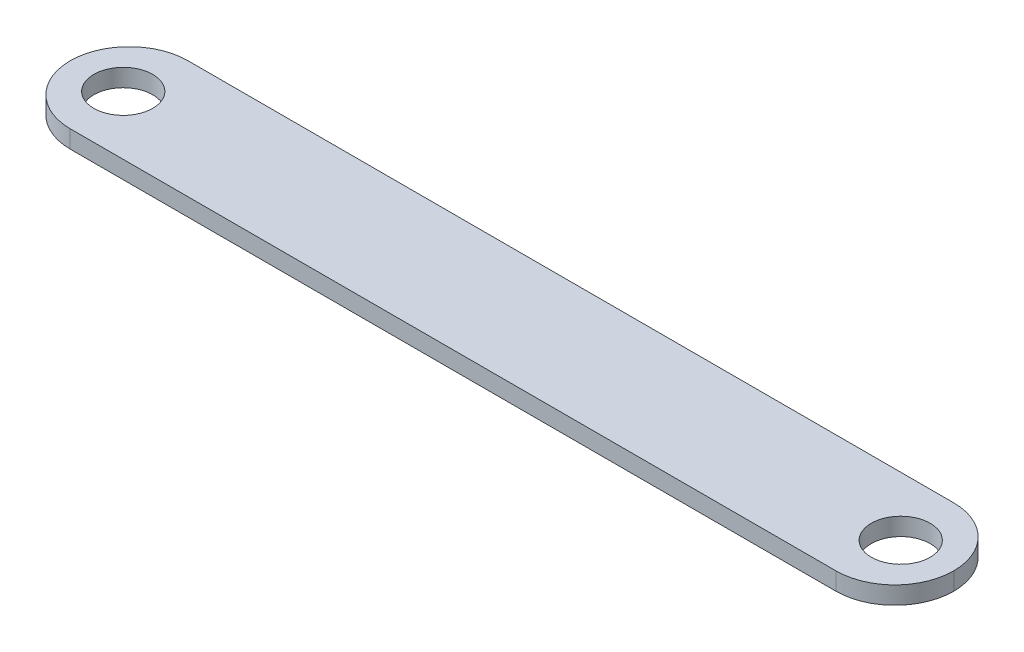
ISO-10303-21;
HEADER;
FILE_DESCRIPTION(('STEP AP214'),'2;1');
FILE_NAME('part.step','',(''),(''),'','','');
FILE_SCHEMA(('AUTOMOTIVE_DESIGN { 1 0 10303 214 1 1 1 1 }'));
ENDSEC;
DATA;
#1=APPLICATION_CONTEXT('core data for automotive mechanical design processes');
#2=APPLICATION_PROTOCOL_DEFINITION('international standard','automotive_design',2000,#1);
#3=PRODUCT_CONTEXT('',#1,'mechanical');
#4=PRODUCT('Part','Part','',(#3));
#5=PRODUCT_RELATED_PRODUCT_CATEGORY('part','',(#4));
#6=PRODUCT_DEFINITION_FORMATION('','',#4);
#7=PRODUCT_DEFINITION_CONTEXT('part definition',#1,'design');
#8=PRODUCT_DEFINITION('design','',#6,#7);
#9=PRODUCT_DEFINITION_SHAPE('','',#8);
#10=(LENGTH_UNIT() NAMED_UNIT(*) SI_UNIT(.MILLI.,.METRE.));
#11=(NAMED_UNIT(*) PLANE_ANGLE_UNIT() SI_UNIT($,.RADIAN.));
#12=(NAMED_UNIT(*) SI_UNIT($,.STERADIAN.) SOLID_ANGLE_UNIT());
#13=UNCERTAINTY_MEASURE_WITH_UNIT(LENGTH_MEASURE(1.E-05),#10,'distance_accuracy_value','');
#14=(GEOMETRIC_REPRESENTATION_CONTEXT(3) GLOBAL_UNCERTAINTY_ASSIGNED_CONTEXT((#13)) GLOBAL_UNIT_ASSIGNED_CONTEXT((#10,
#11,#12)) REPRESENTATION_CONTEXT('',''));
#15=CARTESIAN_POINT('',(0.,0.,0.));
#16=DIRECTION('',(0.,0.,1.));
#17=DIRECTION('',(1.,0.,0.));
#18=AXIS2_PLACEMENT_3D('',#15,#16,#17);
#19=CARTESIAN_POINT('',(0.,3.,0.));
#20=DIRECTION('',(0.,0.,-1.));
#21=DIRECTION('',(-1.,0.,0.));
#22=AXIS2_PLACEMENT_3D('',#19,#20,#21);
#23=PLANE('',#22);
#24=DIRECTION('',(1.,0.,0.));
#25=VECTOR('',#24,1.);
#26=CARTESIAN_POINT('',(0.,0.,0.));
#27=LINE('',#26,#25);
#28=CARTESIAN_POINT('',(10.,0.,0.));
#29=VERTEX_POINT('',#28);
#30=CARTESIAN_POINT('',(140.,0.,0.));
#31=VERTEX_POINT('',#30);
#32=EDGE_CURVE('E99',#29,#31,#27,.T.);
#33=ORIENTED_EDGE('',*,*,#32,.T.);
#34=DIRECTION('',(0.,-1.,0.));
#35=VECTOR('',#34,1.);
#36=CARTESIAN_POINT('',(140.,3.,0.));
#37=LINE('',#36,#35);
#38=CARTESIAN_POINT('',(140.,3.,0.));
#39=VERTEX_POINT('',#38);
#40=EDGE_CURVE('E11',#31,#39,#37,.F.);
#41=ORIENTED_EDGE('',*,*,#40,.T.);
#42=DIRECTION('',(1.,0.,0.));
#43=VECTOR('',#42,1.);
#44=CARTESIAN_POINT('',(0.,3.,0.));
#45=LINE('',#44,#43);
#46=CARTESIAN_POINT('',(10.,3.,0.));
#47=VERTEX_POINT('',#46);
#48=EDGE_CURVE('E141',#47,#39,#45,.T.);
#49=ORIENTED_EDGE('',*,*,#48,.F.);
#50=DIRECTION('',(0.,-1.,0.));
#51=VECTOR('',#50,1.);
#52=CARTESIAN_POINT('',(10.,3.,0.));
#53=LINE('',#52,#51);
#54=EDGE_CURVE('E123',#47,#29,#53,.T.);
#55=ORIENTED_EDGE('',*,*,#54,.T.);
#56=EDGE_LOOP('',(#33,#41,#49,#55));
#57=FACE_BOUND('',#56,.T.);
#58=ADVANCED_FACE('F37',(#57),#23,.F.);
#59=CARTESIAN_POINT('',(0.,3.,-20.));
#60=DIRECTION('',(0.,0.,1.));
#61=DIRECTION('',(1.,0.,0.));
#62=AXIS2_PLACEMENT_3D('',#59,#60,#61);
#63=PLANE('',#62);
#64=DIRECTION('',(-1.,0.,0.));
#65=VECTOR('',#64,1.);
#66=CARTESIAN_POINT('',(0.,3.,-20.));
#67=LINE('',#66,#65);
#68=CARTESIAN_POINT('',(140.,3.,-20.));
#69=VERTEX_POINT('',#68);
#70=CARTESIAN_POINT('',(10.,3.,-20.));
#71=VERTEX_POINT('',#70);
#72=EDGE_CURVE('E102',#69,#71,#67,.T.);
#73=ORIENTED_EDGE('',*,*,#72,.F.);
#74=DIRECTION('',(0.,-1.,0.));
#75=VECTOR('',#74,1.);
#76=CARTESIAN_POINT('',(140.,3.,-20.));
#77=LINE('',#76,#75);
#78=CARTESIAN_POINT('',(140.,0.,-20.));
#79=VERTEX_POINT('',#78);
#80=EDGE_CURVE('E124',#69,#79,#77,.T.);
#81=ORIENTED_EDGE('',*,*,#80,.T.);
#82=DIRECTION('',(-1.,0.,0.));
#83=VECTOR('',#82,1.);
#84=CARTESIAN_POINT('',(0.,0.,-20.));
#85=LINE('',#84,#83);
#86=CARTESIAN_POINT('',(10.,0.,-20.));
#87=VERTEX_POINT('',#86);
#88=EDGE_CURVE('E145',#79,#87,#85,.T.);
#89=ORIENTED_EDGE('',*,*,#88,.T.);
#90=DIRECTION('',(0.,-1.,0.));
#91=VECTOR('',#90,1.);
#92=CARTESIAN_POINT('',(10.,3.,-20.));
#93=LINE('',#92,#91);
#94=EDGE_CURVE('E115',#87,#71,#93,.F.);
#95=ORIENTED_EDGE('',*,*,#94,.T.);
#96=EDGE_LOOP('',(#73,#81,#89,#95));
#97=FACE_BOUND('',#96,.T.);
#98=ADVANCED_FACE('F140',(#97),#63,.F.);
#99=CARTESIAN_POINT('',(0.,3.,0.));
#100=DIRECTION('',(0.,-1.,0.));
#101=DIRECTION('',(0.,0.,-1.));
#102=AXIS2_PLACEMENT_3D('',#99,#100,#101);
#103=PLANE('',#102);
#104=CARTESIAN_POINT('',(141.,3.,-10.));
#105=DIRECTION('',(0.,1.,0.));
#106=DIRECTION('',(0.,0.,1.));
#107=AXIS2_PLACEMENT_3D('',#104,#105,#106);
#108=CIRCLE('',#107,4.99999999999999);
#109=CARTESIAN_POINT('',(141.,3.,-5.00000000000001));
#110=VERTEX_POINT('',#109);
#111=EDGE_CURVE('E111',#110,#110,#108,.T.);
#112=ORIENTED_EDGE('',*,*,#111,.F.);
#113=EDGE_LOOP('',(#112));
#114=FACE_BOUND('',#113,.T.);
#115=CARTESIAN_POINT('',(9.,3.,-10.));
#116=DIRECTION('',(0.,1.,0.));
#117=DIRECTION('',(0.,0.,1.));
#118=AXIS2_PLACEMENT_3D('',#115,#116,#117);
#119=CIRCLE('',#118,5.);
#120=CARTESIAN_POINT('',(9.,3.,-5.));
#121=VERTEX_POINT('',#120);
#122=EDGE_CURVE('E189',#121,#121,#119,.T.);
#123=ORIENTED_EDGE('',*,*,#122,.F.);
#124=EDGE_LOOP('',(#123));
#125=FACE_BOUND('',#124,.T.);
#126=CARTESIAN_POINT('',(140.,3.,-10.));
#127=DIRECTION('',(0.,-1.,0.));
#128=DIRECTION('',(0.,0.,-1.));
#129=AXIS2_PLACEMENT_3D('',#126,#127,#128);
#130=CIRCLE('',#129,10.);
#131=CARTESIAN_POINT('',(150.,3.,-10.));
#132=VERTEX_POINT('',#131);
#133=EDGE_CURVE('E53',#39,#132,#130,.F.);
#134=ORIENTED_EDGE('',*,*,#133,.T.);
#135=CARTESIAN_POINT('',(140.,3.,-10.));
#136=DIRECTION('',(0.,-1.,0.));
#137=DIRECTION('',(0.,0.,-1.));
#138=AXIS2_PLACEMENT_3D('',#135,#136,#137);
#139=CIRCLE('',#138,10.);
#140=EDGE_CURVE('E46',#132,#69,#139,.F.);
#141=ORIENTED_EDGE('',*,*,#140,.T.);
#142=ORIENTED_EDGE('',*,*,#72,.T.);
#143=CARTESIAN_POINT('',(10.,3.,-10.));
#144=DIRECTION('',(0.,-1.,0.));
#145=DIRECTION('',(0.,0.,-1.));
#146=AXIS2_PLACEMENT_3D('',#143,#144,#145);
#147=CIRCLE('',#146,10.);
#148=CARTESIAN_POINT('',(0.,3.,-10.));
#149=VERTEX_POINT('',#148);
#150=EDGE_CURVE('E121',#71,#149,#147,.F.);
#151=ORIENTED_EDGE('',*,*,#150,.T.);
#152=CARTESIAN_POINT('',(10.,3.,-10.));
#153=DIRECTION('',(0.,-1.,0.));
#154=DIRECTION('',(0.,0.,-1.));
#155=AXIS2_PLACEMENT_3D('',#152,#153,#154);
#156=CIRCLE('',#155,10.);
#157=EDGE_CURVE('E108',#149,#47,#156,.F.);
#158=ORIENTED_EDGE('',*,*,#157,.T.);
#159=ORIENTED_EDGE('',*,*,#48,.T.);
#160=EDGE_LOOP('',(#134,#141,#142,#151,#158,#159));
#161=FACE_BOUND('',#160,.T.);
#162=ADVANCED_FACE('F135',(#114,#125,#161),#103,.F.);
#163=CARTESIAN_POINT('',(0.,0.,0.));
#164=DIRECTION('',(0.,-1.,0.));
#165=DIRECTION('',(0.,0.,-1.));
#166=AXIS2_PLACEMENT_3D('',#163,#164,#165);
#167=PLANE('',#166);
#168=CARTESIAN_POINT('',(141.,0.,-10.));
#169=DIRECTION('',(0.,1.,0.));
#170=DIRECTION('',(0.,0.,1.));
#171=AXIS2_PLACEMENT_3D('',#168,#169,#170);
#172=CIRCLE('',#171,4.99999999999999);
#173=CARTESIAN_POINT('',(141.,0.,-5.00000000000001));
#174=VERTEX_POINT('',#173);
#175=EDGE_CURVE('E185',#174,#174,#172,.T.);
#176=ORIENTED_EDGE('',*,*,#175,.T.);
#177=EDGE_LOOP('',(#176));
#178=FACE_BOUND('',#177,.T.);
#179=CARTESIAN_POINT('',(9.,0.,-10.));
#180=DIRECTION('',(0.,1.,0.));
#181=DIRECTION('',(0.,0.,1.));
#182=AXIS2_PLACEMENT_3D('',#179,#180,#181);
#183=CIRCLE('',#182,5.);
#184=CARTESIAN_POINT('',(9.,0.,-5.));
#185=VERTEX_POINT('',#184);
#186=EDGE_CURVE('E188',#185,#185,#183,.T.);
#187=ORIENTED_EDGE('',*,*,#186,.T.);
#188=EDGE_LOOP('',(#187));
#189=FACE_BOUND('',#188,.T.);
#190=ORIENTED_EDGE('',*,*,#88,.F.);
#191=CARTESIAN_POINT('',(140.,0.,-10.));
#192=DIRECTION('',(0.,-1.,0.));
#193=DIRECTION('',(0.,0.,-1.));
#194=AXIS2_PLACEMENT_3D('',#191,#192,#193);
#195=CIRCLE('',#194,10.);
#196=CARTESIAN_POINT('',(150.,0.,-10.));
#197=VERTEX_POINT('',#196);
#198=EDGE_CURVE('E130',#79,#197,#195,.T.);
#199=ORIENTED_EDGE('',*,*,#198,.T.);
#200=CARTESIAN_POINT('',(140.,0.,-10.));
#201=DIRECTION('',(0.,-1.,0.));
#202=DIRECTION('',(0.,0.,-1.));
#203=AXIS2_PLACEMENT_3D('',#200,#201,#202);
#204=CIRCLE('',#203,10.);
#205=EDGE_CURVE('E128',#197,#31,#204,.T.);
#206=ORIENTED_EDGE('',*,*,#205,.T.);
#207=ORIENTED_EDGE('',*,*,#32,.F.);
#208=CARTESIAN_POINT('',(10.,0.,-10.));
#209=DIRECTION('',(0.,-1.,0.));
#210=DIRECTION('',(0.,0.,-1.));
#211=AXIS2_PLACEMENT_3D('',#208,#209,#210);
#212=CIRCLE('',#211,10.);
#213=CARTESIAN_POINT('',(0.,0.,-10.));
#214=VERTEX_POINT('',#213);
#215=EDGE_CURVE('E92',#29,#214,#212,.T.);
#216=ORIENTED_EDGE('',*,*,#215,.T.);
#217=CARTESIAN_POINT('',(10.,0.,-10.));
#218=DIRECTION('',(0.,-1.,0.));
#219=DIRECTION('',(0.,0.,-1.));
#220=AXIS2_PLACEMENT_3D('',#217,#218,#219);
#221=CIRCLE('',#220,10.);
#222=EDGE_CURVE('E97',#214,#87,#221,.T.);
#223=ORIENTED_EDGE('',*,*,#222,.T.);
#224=EDGE_LOOP('',(#190,#199,#206,#207,#216,#223));
#225=FACE_BOUND('',#224,.T.);
#226=ADVANCED_FACE('F95',(#178,#189,#225),#167,.T.);
#227=CARTESIAN_POINT('',(9.,0.,-10.));
#228=DIRECTION('',(0.,1.,0.));
#229=DIRECTION('',(0.,0.,1.));
#230=AXIS2_PLACEMENT_3D('',#227,#228,#229);
#231=CYLINDRICAL_SURFACE('',#230,5.);
#232=ORIENTED_EDGE('',*,*,#186,.F.);
#233=EDGE_LOOP('',(#232));
#234=FACE_BOUND('',#233,.T.);
#235=ORIENTED_EDGE('',*,*,#122,.T.);
#236=EDGE_LOOP('',(#235));
#237=FACE_BOUND('',#236,.T.);
#238=ADVANCED_FACE('F166',(#234,#237),#231,.F.);
#239=CARTESIAN_POINT('',(141.,0.,-10.));
#240=DIRECTION('',(0.,1.,0.));
#241=DIRECTION('',(0.,0.,1.));
#242=AXIS2_PLACEMENT_3D('',#239,#240,#241);
#243=CYLINDRICAL_SURFACE('',#242,4.99999999999999);
#244=ORIENTED_EDGE('',*,*,#175,.F.);
#245=EDGE_LOOP('',(#244));
#246=FACE_BOUND('',#245,.T.);
#247=ORIENTED_EDGE('',*,*,#111,.T.);
#248=EDGE_LOOP('',(#247));
#249=FACE_BOUND('',#248,.T.);
#250=ADVANCED_FACE('F162',(#246,#249),#243,.F.);
#251=CARTESIAN_POINT('',(10.,3.,-10.));
#252=DIRECTION('',(0.,-1.,0.));
#253=DIRECTION('',(0.,0.,-1.));
#254=AXIS2_PLACEMENT_3D('',#251,#252,#253);
#255=CYLINDRICAL_SURFACE('',#254,10.);
#256=ORIENTED_EDGE('',*,*,#54,.F.);
#257=ORIENTED_EDGE('',*,*,#157,.F.);
#258=DIRECTION('',(0.,-1.,0.));
#259=VECTOR('',#258,1.);
#260=CARTESIAN_POINT('',(0.,3.,-10.));
#261=LINE('',#260,#259);
#262=EDGE_CURVE('E106',#214,#149,#261,.F.);
#263=ORIENTED_EDGE('',*,*,#262,.F.);
#264=ORIENTED_EDGE('',*,*,#215,.F.);
#265=EDGE_LOOP('',(#256,#257,#263,#264));
#266=FACE_BOUND('',#265,.T.);
#267=ADVANCED_FACE('F107',(#266),#255,.T.);
#268=CARTESIAN_POINT('',(10.,3.,-10.));
#269=DIRECTION('',(0.,-1.,0.));
#270=DIRECTION('',(0.,0.,-1.));
#271=AXIS2_PLACEMENT_3D('',#268,#269,#270);
#272=CYLINDRICAL_SURFACE('',#271,10.);
#273=ORIENTED_EDGE('',*,*,#150,.F.);
#274=ORIENTED_EDGE('',*,*,#94,.F.);
#275=ORIENTED_EDGE('',*,*,#222,.F.);
#276=ORIENTED_EDGE('',*,*,#262,.T.);
#277=EDGE_LOOP('',(#273,#274,#275,#276));
#278=FACE_BOUND('',#277,.T.);
#279=ADVANCED_FACE('F113',(#278),#272,.T.);
#280=CARTESIAN_POINT('',(140.,3.,-10.));
#281=DIRECTION('',(0.,-1.,0.));
#282=DIRECTION('',(0.,0.,-1.));
#283=AXIS2_PLACEMENT_3D('',#280,#281,#282);
#284=CYLINDRICAL_SURFACE('',#283,10.);
#285=DIRECTION('',(0.,-1.,0.));
#286=VECTOR('',#285,1.);
#287=CARTESIAN_POINT('',(150.,3.,-10.));
#288=LINE('',#287,#286);
#289=EDGE_CURVE('E41',#132,#197,#288,.T.);
#290=ORIENTED_EDGE('',*,*,#289,.F.);
#291=ORIENTED_EDGE('',*,*,#133,.F.);
#292=ORIENTED_EDGE('',*,*,#40,.F.);
#293=ORIENTED_EDGE('',*,*,#205,.F.);
#294=EDGE_LOOP('',(#290,#291,#292,#293));
#295=FACE_BOUND('',#294,.T.);
#296=ADVANCED_FACE('F39',(#295),#284,.T.);
#297=CARTESIAN_POINT('',(140.,3.,-10.));
#298=DIRECTION('',(0.,-1.,0.));
#299=DIRECTION('',(0.,0.,-1.));
#300=AXIS2_PLACEMENT_3D('',#297,#298,#299);
#301=CYLINDRICAL_SURFACE('',#300,10.);
#302=ORIENTED_EDGE('',*,*,#140,.F.);
#303=ORIENTED_EDGE('',*,*,#289,.T.);
#304=ORIENTED_EDGE('',*,*,#198,.F.);
#305=ORIENTED_EDGE('',*,*,#80,.F.);
#306=EDGE_LOOP('',(#302,#303,#304,#305));
#307=FACE_BOUND('',#306,.T.);
#308=ADVANCED_FACE('F143',(#307),#301,.T.);
#309=CLOSED_SHELL('',(#58,#98,#162,#226,#238,#250,#267,#279,#296,#308));
#310=MANIFOLD_SOLID_BREP('B2',#309);
#311=ADVANCED_BREP_SHAPE_REPRESENTATION('',(#18,#310),#14);
#312=SHAPE_DEFINITION_REPRESENTATION(#9,#311);
ENDSEC;
END-ISO-10303-21;
